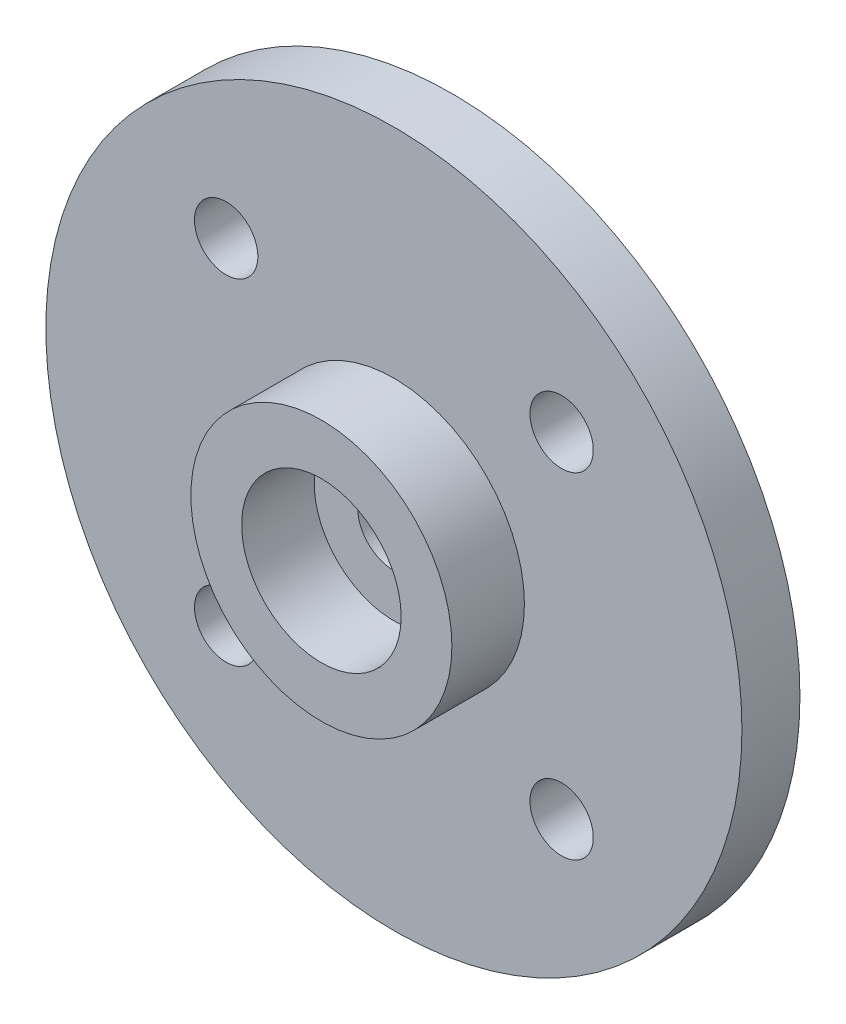
ISO-10303-21;
HEADER;
FILE_DESCRIPTION(('STEP AP214'),'2;1');
FILE_NAME('part.step','',(''),(''),'','','');
FILE_SCHEMA(('AUTOMOTIVE_DESIGN { 1 0 10303 214 1 1 1 1 }'));
ENDSEC;
DATA;
#1=APPLICATION_CONTEXT('core data for automotive mechanical design processes');
#2=APPLICATION_PROTOCOL_DEFINITION('international standard','automotive_design',2000,#1);
#3=PRODUCT_CONTEXT('',#1,'mechanical');
#4=PRODUCT('Part','Part','',(#3));
#5=PRODUCT_RELATED_PRODUCT_CATEGORY('part','',(#4));
#6=PRODUCT_DEFINITION_FORMATION('','',#4);
#7=PRODUCT_DEFINITION_CONTEXT('part definition',#1,'design');
#8=PRODUCT_DEFINITION('design','',#6,#7);
#9=PRODUCT_DEFINITION_SHAPE('','',#8);
#10=(LENGTH_UNIT() NAMED_UNIT(*) SI_UNIT(.MILLI.,.METRE.));
#11=(NAMED_UNIT(*) PLANE_ANGLE_UNIT() SI_UNIT($,.RADIAN.));
#12=(NAMED_UNIT(*) SI_UNIT($,.STERADIAN.) SOLID_ANGLE_UNIT());
#13=UNCERTAINTY_MEASURE_WITH_UNIT(LENGTH_MEASURE(1.E-05),#10,'distance_accuracy_value','');
#14=(GEOMETRIC_REPRESENTATION_CONTEXT(3) GLOBAL_UNCERTAINTY_ASSIGNED_CONTEXT((#13)) GLOBAL_UNIT_ASSIGNED_CONTEXT((#10,
#11,#12)) REPRESENTATION_CONTEXT('',''));
#15=CARTESIAN_POINT('',(0.,0.,0.));
#16=DIRECTION('',(0.,0.,1.));
#17=DIRECTION('',(1.,0.,0.));
#18=AXIS2_PLACEMENT_3D('',#15,#16,#17);
#19=CARTESIAN_POINT('',(5.7828,5.7828,-32.3074335968169));
#20=DIRECTION('',(0.,0.,1.));
#21=DIRECTION('',(1.,0.,0.));
#22=AXIS2_PLACEMENT_3D('',#19,#20,#21);
#23=CYLINDRICAL_SURFACE('',#22,1.0922);
#24=CARTESIAN_POINT('',(5.7828,5.7828,0.));
#25=DIRECTION('',(0.,0.,1.));
#26=DIRECTION('',(1.,0.,0.));
#27=AXIS2_PLACEMENT_3D('',#24,#25,#26);
#28=CIRCLE('',#27,1.0922);
#29=CARTESIAN_POINT('',(4.6906,5.7828,0.));
#30=VERTEX_POINT('',#29);
#31=EDGE_CURVE('E39',#30,#30,#28,.T.);
#32=ORIENTED_EDGE('',*,*,#31,.F.);
#33=EDGE_LOOP('',(#32));
#34=FACE_BOUND('',#33,.T.);
#35=CARTESIAN_POINT('',(5.7828,5.7828,2.));
#36=DIRECTION('',(0.,0.,-1.));
#37=DIRECTION('',(1.,0.,0.));
#38=AXIS2_PLACEMENT_3D('',#35,#36,#37);
#39=CIRCLE('',#38,1.0922);
#40=CARTESIAN_POINT('',(4.6906,5.7828,2.));
#41=VERTEX_POINT('',#40);
#42=EDGE_CURVE('E146',#41,#41,#39,.T.);
#43=ORIENTED_EDGE('',*,*,#42,.F.);
#44=EDGE_LOOP('',(#43));
#45=FACE_BOUND('',#44,.T.);
#46=ADVANCED_FACE('F16',(#34,#45),#23,.F.);
#47=CARTESIAN_POINT('',(-5.7828,-5.7828,-32.3074335968169));
#48=DIRECTION('',(0.,0.,1.));
#49=DIRECTION('',(1.,0.,0.));
#50=AXIS2_PLACEMENT_3D('',#47,#48,#49);
#51=CYLINDRICAL_SURFACE('',#50,1.0922);
#52=CARTESIAN_POINT('',(-5.7828,-5.7828,0.));
#53=DIRECTION('',(0.,0.,1.));
#54=DIRECTION('',(1.,0.,0.));
#55=AXIS2_PLACEMENT_3D('',#52,#53,#54);
#56=CIRCLE('',#55,1.0922);
#57=CARTESIAN_POINT('',(-6.875,-5.7828,0.));
#58=VERTEX_POINT('',#57);
#59=EDGE_CURVE('E159',#58,#58,#56,.T.);
#60=ORIENTED_EDGE('',*,*,#59,.F.);
#61=EDGE_LOOP('',(#60));
#62=FACE_BOUND('',#61,.T.);
#63=CARTESIAN_POINT('',(-5.7828,-5.7828,2.));
#64=DIRECTION('',(0.,0.,-1.));
#65=DIRECTION('',(1.,0.,0.));
#66=AXIS2_PLACEMENT_3D('',#63,#64,#65);
#67=CIRCLE('',#66,1.0922);
#68=CARTESIAN_POINT('',(-6.875,-5.7828,2.));
#69=VERTEX_POINT('',#68);
#70=EDGE_CURVE('E141',#69,#69,#67,.T.);
#71=ORIENTED_EDGE('',*,*,#70,.F.);
#72=EDGE_LOOP('',(#71));
#73=FACE_BOUND('',#72,.T.);
#74=ADVANCED_FACE('F18',(#62,#73),#51,.F.);
#75=CARTESIAN_POINT('',(5.7828,-5.7828,-32.3074335968169));
#76=DIRECTION('',(0.,0.,1.));
#77=DIRECTION('',(1.,0.,0.));
#78=AXIS2_PLACEMENT_3D('',#75,#76,#77);
#79=CYLINDRICAL_SURFACE('',#78,1.0922);
#80=CARTESIAN_POINT('',(5.7828,-5.7828,0.));
#81=DIRECTION('',(0.,0.,1.));
#82=DIRECTION('',(1.,0.,0.));
#83=AXIS2_PLACEMENT_3D('',#80,#81,#82);
#84=CIRCLE('',#83,1.0922);
#85=CARTESIAN_POINT('',(4.6906,-5.7828,0.));
#86=VERTEX_POINT('',#85);
#87=EDGE_CURVE('E155',#86,#86,#84,.T.);
#88=ORIENTED_EDGE('',*,*,#87,.F.);
#89=EDGE_LOOP('',(#88));
#90=FACE_BOUND('',#89,.T.);
#91=CARTESIAN_POINT('',(5.7828,-5.7828,2.));
#92=DIRECTION('',(0.,0.,-1.));
#93=DIRECTION('',(1.,0.,0.));
#94=AXIS2_PLACEMENT_3D('',#91,#92,#93);
#95=CIRCLE('',#94,1.0922);
#96=CARTESIAN_POINT('',(4.6906,-5.7828,2.));
#97=VERTEX_POINT('',#96);
#98=EDGE_CURVE('E145',#97,#97,#95,.T.);
#99=ORIENTED_EDGE('',*,*,#98,.F.);
#100=EDGE_LOOP('',(#99));
#101=FACE_BOUND('',#100,.T.);
#102=ADVANCED_FACE('F218',(#90,#101),#79,.F.);
#103=CARTESIAN_POINT('',(-5.7828,5.7828,-32.3074335968169));
#104=DIRECTION('',(0.,0.,1.));
#105=DIRECTION('',(1.,0.,0.));
#106=AXIS2_PLACEMENT_3D('',#103,#104,#105);
#107=CYLINDRICAL_SURFACE('',#106,1.0922);
#108=CARTESIAN_POINT('',(-5.7828,5.7828,0.));
#109=DIRECTION('',(0.,0.,1.));
#110=DIRECTION('',(1.,0.,0.));
#111=AXIS2_PLACEMENT_3D('',#108,#109,#110);
#112=CIRCLE('',#111,1.0922);
#113=CARTESIAN_POINT('',(-6.875,5.7828,0.));
#114=VERTEX_POINT('',#113);
#115=EDGE_CURVE('E97',#114,#114,#112,.T.);
#116=ORIENTED_EDGE('',*,*,#115,.F.);
#117=EDGE_LOOP('',(#116));
#118=FACE_BOUND('',#117,.T.);
#119=CARTESIAN_POINT('',(-5.7828,5.7828,2.));
#120=DIRECTION('',(0.,0.,-1.));
#121=DIRECTION('',(1.,0.,0.));
#122=AXIS2_PLACEMENT_3D('',#119,#120,#121);
#123=CIRCLE('',#122,1.0922);
#124=CARTESIAN_POINT('',(-6.875,5.7828,2.));
#125=VERTEX_POINT('',#124);
#126=EDGE_CURVE('E27',#125,#125,#123,.T.);
#127=ORIENTED_EDGE('',*,*,#126,.F.);
#128=EDGE_LOOP('',(#127));
#129=FACE_BOUND('',#128,.T.);
#130=ADVANCED_FACE('F226',(#118,#129),#107,.F.);
#131=CARTESIAN_POINT('',(0.,0.,2.));
#132=DIRECTION('',(0.,0.,1.));
#133=DIRECTION('',(1.,0.,0.));
#134=AXIS2_PLACEMENT_3D('',#131,#132,#133);
#135=PLANE('',#134);
#136=CARTESIAN_POINT('',(0.,0.,2.));
#137=DIRECTION('',(0.,0.,-1.));
#138=DIRECTION('',(1.,0.,0.));
#139=AXIS2_PLACEMENT_3D('',#136,#137,#138);
#140=CIRCLE('',#139,12.);
#141=CARTESIAN_POINT('',(12.,0.,2.));
#142=VERTEX_POINT('',#141);
#143=EDGE_CURVE('E138',#142,#142,#140,.T.);
#144=ORIENTED_EDGE('',*,*,#143,.F.);
#145=EDGE_LOOP('',(#144));
#146=FACE_BOUND('',#145,.T.);
#147=CARTESIAN_POINT('',(0.,0.,2.));
#148=DIRECTION('',(0.,0.,-1.));
#149=DIRECTION('',(1.,0.,0.));
#150=AXIS2_PLACEMENT_3D('',#147,#148,#149);
#151=CIRCLE('',#150,4.5);
#152=CARTESIAN_POINT('',(4.5,0.,2.));
#153=VERTEX_POINT('',#152);
#154=EDGE_CURVE('E10',#153,#153,#151,.T.);
#155=ORIENTED_EDGE('',*,*,#154,.T.);
#156=EDGE_LOOP('',(#155));
#157=FACE_BOUND('',#156,.T.);
#158=ORIENTED_EDGE('',*,*,#126,.T.);
#159=EDGE_LOOP('',(#158));
#160=FACE_BOUND('',#159,.T.);
#161=ORIENTED_EDGE('',*,*,#98,.T.);
#162=EDGE_LOOP('',(#161));
#163=FACE_BOUND('',#162,.T.);
#164=ORIENTED_EDGE('',*,*,#70,.T.);
#165=EDGE_LOOP('',(#164));
#166=FACE_BOUND('',#165,.T.);
#167=ORIENTED_EDGE('',*,*,#42,.T.);
#168=EDGE_LOOP('',(#167));
#169=FACE_BOUND('',#168,.T.);
#170=ADVANCED_FACE('F222',(#146,#157,#160,#163,#166,#169),#135,.T.);
#171=CARTESIAN_POINT('',(0.,0.,0.));
#172=DIRECTION('',(0.,0.,1.));
#173=DIRECTION('',(1.,0.,0.));
#174=AXIS2_PLACEMENT_3D('',#171,#172,#173);
#175=PLANE('',#174);
#176=CARTESIAN_POINT('',(0.,0.,0.));
#177=DIRECTION('',(0.,0.,1.));
#178=DIRECTION('',(1.,0.,0.));
#179=AXIS2_PLACEMENT_3D('',#176,#177,#178);
#180=CIRCLE('',#179,12.);
#181=CARTESIAN_POINT('',(12.,0.,0.));
#182=VERTEX_POINT('',#181);
#183=EDGE_CURVE('E176',#182,#182,#180,.T.);
#184=ORIENTED_EDGE('',*,*,#183,.F.);
#185=EDGE_LOOP('',(#184));
#186=FACE_BOUND('',#185,.T.);
#187=CARTESIAN_POINT('',(0.,0.,0.));
#188=DIRECTION('',(0.,0.,1.));
#189=DIRECTION('',(-1.,0.,0.));
#190=AXIS2_PLACEMENT_3D('',#187,#188,#189);
#191=CIRCLE('',#190,3.75);
#192=CARTESIAN_POINT('',(-3.75,0.,0.));
#193=VERTEX_POINT('',#192);
#194=EDGE_CURVE('E169',#193,#193,#191,.T.);
#195=ORIENTED_EDGE('',*,*,#194,.T.);
#196=EDGE_LOOP('',(#195));
#197=FACE_BOUND('',#196,.T.);
#198=ORIENTED_EDGE('',*,*,#115,.T.);
#199=EDGE_LOOP('',(#198));
#200=FACE_BOUND('',#199,.T.);
#201=ORIENTED_EDGE('',*,*,#87,.T.);
#202=EDGE_LOOP('',(#201));
#203=FACE_BOUND('',#202,.T.);
#204=ORIENTED_EDGE('',*,*,#59,.T.);
#205=EDGE_LOOP('',(#204));
#206=FACE_BOUND('',#205,.T.);
#207=ORIENTED_EDGE('',*,*,#31,.T.);
#208=EDGE_LOOP('',(#207));
#209=FACE_BOUND('',#208,.T.);
#210=ADVANCED_FACE('F225',(#186,#197,#200,#203,#206,#209),#175,.F.);
#211=CARTESIAN_POINT('',(0.,0.,-34.3074335968169));
#212=DIRECTION('',(0.,0.,1.));
#213=DIRECTION('',(1.,0.,0.));
#214=AXIS2_PLACEMENT_3D('',#211,#212,#213);
#215=CYLINDRICAL_SURFACE('',#214,1.25);
#216=CARTESIAN_POINT('',(0.,0.,2.));
#217=DIRECTION('',(0.,0.,-1.));
#218=DIRECTION('',(1.,0.,0.));
#219=AXIS2_PLACEMENT_3D('',#216,#217,#218);
#220=CIRCLE('',#219,1.25);
#221=CARTESIAN_POINT('',(-1.25,0.,2.));
#222=VERTEX_POINT('',#221);
#223=EDGE_CURVE('E123',#222,#222,#220,.T.);
#224=ORIENTED_EDGE('',*,*,#223,.F.);
#225=EDGE_LOOP('',(#224));
#226=FACE_BOUND('',#225,.T.);
#227=CARTESIAN_POINT('',(0.,0.,0.));
#228=DIRECTION('',(0.,0.,1.));
#229=DIRECTION('',(1.,0.,0.));
#230=AXIS2_PLACEMENT_3D('',#227,#228,#229);
#231=CIRCLE('',#230,1.25);
#232=CARTESIAN_POINT('',(-1.25,0.,0.));
#233=VERTEX_POINT('',#232);
#234=EDGE_CURVE('E154',#233,#233,#231,.T.);
#235=ORIENTED_EDGE('',*,*,#234,.F.);
#236=EDGE_LOOP('',(#235));
#237=FACE_BOUND('',#236,.T.);
#238=ADVANCED_FACE('F228',(#226,#237),#215,.F.);
#239=CARTESIAN_POINT('',(0.,0.,0.));
#240=DIRECTION('',(0.,0.,-1.));
#241=DIRECTION('',(-1.,0.,0.));
#242=AXIS2_PLACEMENT_3D('',#239,#240,#241);
#243=CYLINDRICAL_SURFACE('',#242,3.75);
#244=CARTESIAN_POINT('',(0.,0.,-0.5));
#245=DIRECTION('',(0.,0.,1.));
#246=DIRECTION('',(-1.,0.,0.));
#247=AXIS2_PLACEMENT_3D('',#244,#245,#246);
#248=CIRCLE('',#247,3.75);
#249=CARTESIAN_POINT('',(-3.75,0.,-0.5));
#250=VERTEX_POINT('',#249);
#251=EDGE_CURVE('E153',#250,#250,#248,.T.);
#252=ORIENTED_EDGE('',*,*,#251,.T.);
#253=EDGE_LOOP('',(#252));
#254=FACE_BOUND('',#253,.T.);
#255=ORIENTED_EDGE('',*,*,#194,.F.);
#256=EDGE_LOOP('',(#255));
#257=FACE_BOUND('',#256,.T.);
#258=ADVANCED_FACE('F194',(#254,#257),#243,.T.);
#259=CARTESIAN_POINT('',(0.,0.,0.));
#260=DIRECTION('',(0.,0.,-1.));
#261=DIRECTION('',(-1.,0.,0.));
#262=AXIS2_PLACEMENT_3D('',#259,#260,#261);
#263=CYLINDRICAL_SURFACE('',#262,3.);
#264=CARTESIAN_POINT('',(0.,0.,-0.5));
#265=DIRECTION('',(0.,0.,-1.));
#266=DIRECTION('',(-1.,0.,0.));
#267=AXIS2_PLACEMENT_3D('',#264,#265,#266);
#268=CIRCLE('',#267,3.);
#269=CARTESIAN_POINT('',(-3.,0.,-0.5));
#270=VERTEX_POINT('',#269);
#271=EDGE_CURVE('E149',#270,#270,#268,.T.);
#272=ORIENTED_EDGE('',*,*,#271,.T.);
#273=EDGE_LOOP('',(#272));
#274=FACE_BOUND('',#273,.T.);
#275=CARTESIAN_POINT('',(0.,0.,0.));
#276=DIRECTION('',(0.,0.,-1.));
#277=DIRECTION('',(-1.,0.,0.));
#278=AXIS2_PLACEMENT_3D('',#275,#276,#277);
#279=CIRCLE('',#278,3.);
#280=CARTESIAN_POINT('',(-3.,0.,0.));
#281=VERTEX_POINT('',#280);
#282=EDGE_CURVE('E130',#281,#281,#279,.T.);
#283=ORIENTED_EDGE('',*,*,#282,.F.);
#284=EDGE_LOOP('',(#283));
#285=FACE_BOUND('',#284,.T.);
#286=ADVANCED_FACE('F200',(#274,#285),#263,.F.);
#287=CARTESIAN_POINT('',(0.,0.,-0.5));
#288=DIRECTION('',(0.,0.,-1.));
#289=DIRECTION('',(0.,-1.,0.));
#290=AXIS2_PLACEMENT_3D('',#287,#288,#289);
#291=PLANE('',#290);
#292=ORIENTED_EDGE('',*,*,#271,.F.);
#293=EDGE_LOOP('',(#292));
#294=FACE_BOUND('',#293,.T.);
#295=ORIENTED_EDGE('',*,*,#251,.F.);
#296=EDGE_LOOP('',(#295));
#297=FACE_BOUND('',#296,.T.);
#298=ADVANCED_FACE('F197',(#294,#297),#291,.T.);
#299=CARTESIAN_POINT('',(0.,0.,0.));
#300=DIRECTION('',(0.,0.,1.));
#301=DIRECTION('',(1.,0.,0.));
#302=AXIS2_PLACEMENT_3D('',#299,#300,#301);
#303=PLANE('',#302);
#304=ORIENTED_EDGE('',*,*,#234,.T.);
#305=EDGE_LOOP('',(#304));
#306=FACE_BOUND('',#305,.T.);
#307=ORIENTED_EDGE('',*,*,#282,.T.);
#308=EDGE_LOOP('',(#307));
#309=FACE_BOUND('',#308,.T.);
#310=ADVANCED_FACE('F199',(#306,#309),#303,.F.);
#311=CARTESIAN_POINT('',(0.,0.,4.5));
#312=DIRECTION('',(0.,0.,-1.));
#313=DIRECTION('',(1.,0.,0.));
#314=AXIS2_PLACEMENT_3D('',#311,#312,#313);
#315=CYLINDRICAL_SURFACE('',#314,2.75);
#316=CARTESIAN_POINT('',(0.,0.,2.));
#317=DIRECTION('',(0.,0.,1.));
#318=DIRECTION('',(1.,0.,0.));
#319=AXIS2_PLACEMENT_3D('',#316,#317,#318);
#320=CIRCLE('',#319,2.75);
#321=CARTESIAN_POINT('',(2.75,0.,2.));
#322=VERTEX_POINT('',#321);
#323=EDGE_CURVE('E20',#322,#322,#320,.T.);
#324=ORIENTED_EDGE('',*,*,#323,.F.);
#325=EDGE_LOOP('',(#324));
#326=FACE_BOUND('',#325,.T.);
#327=CARTESIAN_POINT('',(0.,0.,4.5));
#328=DIRECTION('',(0.,0.,-1.));
#329=DIRECTION('',(1.,0.,0.));
#330=AXIS2_PLACEMENT_3D('',#327,#328,#329);
#331=CIRCLE('',#330,2.75);
#332=CARTESIAN_POINT('',(2.75,0.,4.5));
#333=VERTEX_POINT('',#332);
#334=EDGE_CURVE('E133',#333,#333,#331,.T.);
#335=ORIENTED_EDGE('',*,*,#334,.F.);
#336=EDGE_LOOP('',(#335));
#337=FACE_BOUND('',#336,.T.);
#338=ADVANCED_FACE('F119',(#326,#337),#315,.F.);
#339=CARTESIAN_POINT('',(0.,0.,2.));
#340=DIRECTION('',(0.,0.,1.));
#341=DIRECTION('',(1.,0.,0.));
#342=AXIS2_PLACEMENT_3D('',#339,#340,#341);
#343=PLANE('',#342);
#344=ORIENTED_EDGE('',*,*,#223,.T.);
#345=EDGE_LOOP('',(#344));
#346=FACE_BOUND('',#345,.T.);
#347=ORIENTED_EDGE('',*,*,#323,.T.);
#348=EDGE_LOOP('',(#347));
#349=FACE_BOUND('',#348,.T.);
#350=ADVANCED_FACE('F268',(#346,#349),#343,.T.);
#351=CARTESIAN_POINT('',(0.,0.,2.));
#352=DIRECTION('',(0.,0.,1.));
#353=DIRECTION('',(1.,0.,0.));
#354=AXIS2_PLACEMENT_3D('',#351,#352,#353);
#355=CYLINDRICAL_SURFACE('',#354,4.5);
#356=CARTESIAN_POINT('',(0.,0.,4.5));
#357=DIRECTION('',(0.,0.,-1.));
#358=DIRECTION('',(1.,0.,0.));
#359=AXIS2_PLACEMENT_3D('',#356,#357,#358);
#360=CIRCLE('',#359,4.5);
#361=CARTESIAN_POINT('',(4.5,0.,4.5));
#362=VERTEX_POINT('',#361);
#363=EDGE_CURVE('E124',#362,#362,#360,.T.);
#364=ORIENTED_EDGE('',*,*,#363,.T.);
#365=EDGE_LOOP('',(#364));
#366=FACE_BOUND('',#365,.T.);
#367=ORIENTED_EDGE('',*,*,#154,.F.);
#368=EDGE_LOOP('',(#367));
#369=FACE_BOUND('',#368,.T.);
#370=ADVANCED_FACE('F235',(#366,#369),#355,.T.);
#371=CARTESIAN_POINT('',(0.,0.,4.5));
#372=DIRECTION('',(0.,0.,1.));
#373=DIRECTION('',(1.,0.,0.));
#374=AXIS2_PLACEMENT_3D('',#371,#372,#373);
#375=PLANE('',#374);
#376=ORIENTED_EDGE('',*,*,#334,.T.);
#377=EDGE_LOOP('',(#376));
#378=FACE_BOUND('',#377,.T.);
#379=ORIENTED_EDGE('',*,*,#363,.F.);
#380=EDGE_LOOP('',(#379));
#381=FACE_BOUND('',#380,.T.);
#382=ADVANCED_FACE('F232',(#378,#381),#375,.T.);
#383=CARTESIAN_POINT('',(0.,0.,0.));
#384=DIRECTION('',(0.,0.,1.));
#385=DIRECTION('',(1.,0.,0.));
#386=AXIS2_PLACEMENT_3D('',#383,#384,#385);
#387=CYLINDRICAL_SURFACE('',#386,12.);
#388=ORIENTED_EDGE('',*,*,#143,.T.);
#389=EDGE_LOOP('',(#388));
#390=FACE_BOUND('',#389,.T.);
#391=ORIENTED_EDGE('',*,*,#183,.T.);
#392=EDGE_LOOP('',(#391));
#393=FACE_BOUND('',#392,.T.);
#394=ADVANCED_FACE('F234',(#390,#393),#387,.T.);
#395=CLOSED_SHELL('',(#46,#74,#102,#130,#170,#210,#238,#258,#286,#298,#310,#338,#350,#370,#382,#394));
#396=MANIFOLD_SOLID_BREP('B1',#395);
#397=ADVANCED_BREP_SHAPE_REPRESENTATION('',(#18,#396),#14);
#398=SHAPE_DEFINITION_REPRESENTATION(#9,#397);
ENDSEC;
END-ISO-10303-21;
